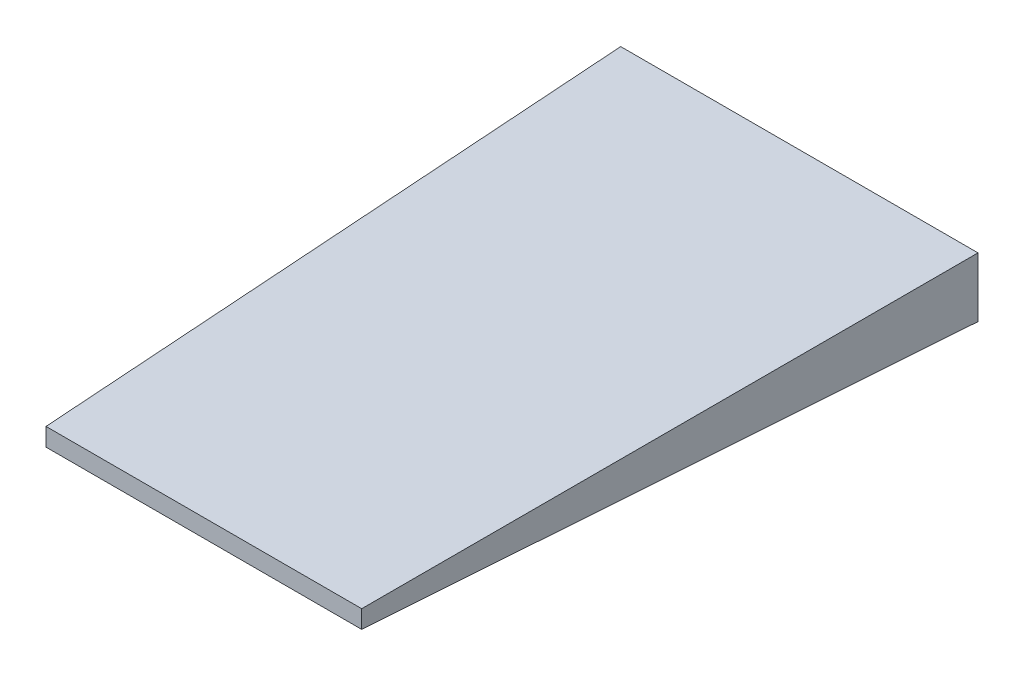
ISO-10303-21;
HEADER;
FILE_DESCRIPTION(('STEP AP214'),'2;1');
FILE_NAME('part.step','',(''),(''),'','','');
FILE_SCHEMA(('AUTOMOTIVE_DESIGN { 1 0 10303 214 1 1 1 1 }'));
ENDSEC;
DATA;
#1=APPLICATION_CONTEXT('core data for automotive mechanical design processes');
#2=APPLICATION_PROTOCOL_DEFINITION('international standard','automotive_design',2000,#1);
#3=PRODUCT_CONTEXT('',#1,'mechanical');
#4=PRODUCT('Part','Part','',(#3));
#5=PRODUCT_RELATED_PRODUCT_CATEGORY('part','',(#4));
#6=PRODUCT_DEFINITION_FORMATION('','',#4);
#7=PRODUCT_DEFINITION_CONTEXT('part definition',#1,'design');
#8=PRODUCT_DEFINITION('design','',#6,#7);
#9=PRODUCT_DEFINITION_SHAPE('','',#8);
#10=(LENGTH_UNIT() NAMED_UNIT(*) SI_UNIT(.MILLI.,.METRE.));
#11=(NAMED_UNIT(*) PLANE_ANGLE_UNIT() SI_UNIT($,.RADIAN.));
#12=(NAMED_UNIT(*) SI_UNIT($,.STERADIAN.) SOLID_ANGLE_UNIT());
#13=UNCERTAINTY_MEASURE_WITH_UNIT(LENGTH_MEASURE(1.E-05),#10,'distance_accuracy_value','');
#14=(GEOMETRIC_REPRESENTATION_CONTEXT(3) GLOBAL_UNCERTAINTY_ASSIGNED_CONTEXT((#13)) GLOBAL_UNIT_ASSIGNED_CONTEXT((#10,
#11,#12)) REPRESENTATION_CONTEXT('',''));
#15=CARTESIAN_POINT('',(0.,0.,0.));
#16=DIRECTION('',(0.,0.,1.));
#17=DIRECTION('',(1.,0.,0.));
#18=AXIS2_PLACEMENT_3D('',#15,#16,#17);
#19=CARTESIAN_POINT('',(-76.2,12.7,0.));
#20=DIRECTION('',(0.,0.999390827019096,0.034899496702501));
#21=DIRECTION('',(0.,-0.0348994967025011,0.999390827019096));
#22=AXIS2_PLACEMENT_3D('',#19,#20,#21);
#23=PLANE('',#22);
#24=DIRECTION('',(1.,0.,0.));
#25=VECTOR('',#24,1.);
#26=CARTESIAN_POINT('',(-76.2,12.7,0.));
#27=LINE('',#26,#25);
#28=CARTESIAN_POINT('',(-76.2,12.7,0.));
#29=VERTEX_POINT('',#28);
#30=CARTESIAN_POINT('',(76.2,12.7,0.));
#31=VERTEX_POINT('',#30);
#32=EDGE_CURVE('E83',#29,#31,#27,.T.);
#33=ORIENTED_EDGE('',*,*,#32,.F.);
#34=DIRECTION('',(-0.0348782627423747,0.0348782627423747,-0.998782765958718));
#35=VECTOR('',#34,1.);
#36=CARTESIAN_POINT('',(-76.1691010724171,12.6691010724171,0.884829516435063));
#37=LINE('',#36,#35);
#38=CARTESIAN_POINT('',(-67.3301245490961,3.83012454909606,254.));
#39=VERTEX_POINT('',#38);
#40=EDGE_CURVE('E11',#39,#29,#37,.T.);
#41=ORIENTED_EDGE('',*,*,#40,.F.);
#42=DIRECTION('',(1.,0.,0.));
#43=VECTOR('',#42,1.);
#44=CARTESIAN_POINT('',(-76.2,3.83012454909606,254.));
#45=LINE('',#44,#43);
#46=CARTESIAN_POINT('',(67.3301245490961,3.83012454909606,254.));
#47=VERTEX_POINT('',#46);
#48=EDGE_CURVE('E85',#39,#47,#45,.T.);
#49=ORIENTED_EDGE('',*,*,#48,.T.);
#50=DIRECTION('',(-0.0348782627423747,-0.0348782627423747,0.998782765958718));
#51=VECTOR('',#50,1.);
#52=CARTESIAN_POINT('',(76.1691010724171,12.6691010724171,0.884829516435063));
#53=LINE('',#52,#51);
#54=EDGE_CURVE('E80',#47,#31,#53,.F.);
#55=ORIENTED_EDGE('',*,*,#54,.T.);
#56=EDGE_LOOP('',(#33,#41,#49,#55));
#57=FACE_BOUND('',#56,.T.);
#58=ADVANCED_FACE('F33',(#57),#23,.T.);
#59=CARTESIAN_POINT('',(-76.2,-12.7,0.));
#60=DIRECTION('',(-0.999390827019096,0.,0.034899496702501));
#61=DIRECTION('',(0.034899496702501,0.,0.999390827019096));
#62=AXIS2_PLACEMENT_3D('',#59,#60,#61);
#63=PLANE('',#62);
#64=DIRECTION('',(0.,1.,0.));
#65=VECTOR('',#64,1.);
#66=CARTESIAN_POINT('',(-76.2,-12.7,0.));
#67=LINE('',#66,#65);
#68=CARTESIAN_POINT('',(-76.2,-12.7,0.));
#69=VERTEX_POINT('',#68);
#70=EDGE_CURVE('E98',#69,#29,#67,.T.);
#71=ORIENTED_EDGE('',*,*,#70,.F.);
#72=DIRECTION('',(0.0348782627423747,0.0348782627423747,0.998782765958718));
#73=VECTOR('',#72,1.);
#74=CARTESIAN_POINT('',(-76.2,-12.7,0.));
#75=LINE('',#74,#73);
#76=CARTESIAN_POINT('',(-67.3301245490961,-3.83012454909606,254.));
#77=VERTEX_POINT('',#76);
#78=EDGE_CURVE('E43',#77,#69,#75,.F.);
#79=ORIENTED_EDGE('',*,*,#78,.F.);
#80=DIRECTION('',(0.,1.,0.));
#81=VECTOR('',#80,1.);
#82=CARTESIAN_POINT('',(-67.3301245490961,-12.7,254.));
#83=LINE('',#82,#81);
#84=EDGE_CURVE('E88',#77,#39,#83,.T.);
#85=ORIENTED_EDGE('',*,*,#84,.T.);
#86=ORIENTED_EDGE('',*,*,#40,.T.);
#87=EDGE_LOOP('',(#71,#79,#85,#86));
#88=FACE_BOUND('',#87,.T.);
#89=ADVANCED_FACE('F35',(#88),#63,.T.);
#90=CARTESIAN_POINT('',(-76.2,-12.7,0.));
#91=DIRECTION('',(0.,-0.999390827019096,0.034899496702501));
#92=DIRECTION('',(0.,-0.0348994967025011,-0.999390827019096));
#93=AXIS2_PLACEMENT_3D('',#90,#91,#92);
#94=PLANE('',#93);
#95=DIRECTION('',(1.,0.,0.));
#96=VECTOR('',#95,1.);
#97=CARTESIAN_POINT('',(-76.2,-12.7,0.));
#98=LINE('',#97,#96);
#99=CARTESIAN_POINT('',(76.2,-12.7,0.));
#100=VERTEX_POINT('',#99);
#101=EDGE_CURVE('E95',#69,#100,#98,.T.);
#102=ORIENTED_EDGE('',*,*,#101,.T.);
#103=DIRECTION('',(0.0348782627423747,-0.0348782627423747,-0.998782765958718));
#104=VECTOR('',#103,1.);
#105=CARTESIAN_POINT('',(76.2,-12.7,0.));
#106=LINE('',#105,#104);
#107=CARTESIAN_POINT('',(67.3301245490961,-3.83012454909606,254.));
#108=VERTEX_POINT('',#107);
#109=EDGE_CURVE('E87',#108,#100,#106,.T.);
#110=ORIENTED_EDGE('',*,*,#109,.F.);
#111=DIRECTION('',(-1.,0.,0.));
#112=VECTOR('',#111,1.);
#113=CARTESIAN_POINT('',(-76.2,-3.83012454909606,254.));
#114=LINE('',#113,#112);
#115=EDGE_CURVE('E63',#77,#108,#114,.F.);
#116=ORIENTED_EDGE('',*,*,#115,.F.);
#117=ORIENTED_EDGE('',*,*,#78,.T.);
#118=EDGE_LOOP('',(#102,#110,#116,#117));
#119=FACE_BOUND('',#118,.T.);
#120=ADVANCED_FACE('F114',(#119),#94,.T.);
#121=CARTESIAN_POINT('',(76.2,-12.7,0.));
#122=DIRECTION('',(0.999390827019096,0.,0.034899496702501));
#123=DIRECTION('',(0.034899496702501,0.,-0.999390827019096));
#124=AXIS2_PLACEMENT_3D('',#121,#122,#123);
#125=PLANE('',#124);
#126=DIRECTION('',(0.,1.,0.));
#127=VECTOR('',#126,1.);
#128=CARTESIAN_POINT('',(76.2,-12.7,0.));
#129=LINE('',#128,#127);
#130=EDGE_CURVE('E92',#100,#31,#129,.T.);
#131=ORIENTED_EDGE('',*,*,#130,.T.);
#132=ORIENTED_EDGE('',*,*,#54,.F.);
#133=DIRECTION('',(0.,-1.,0.));
#134=VECTOR('',#133,1.);
#135=CARTESIAN_POINT('',(67.3301245490961,-12.7,254.));
#136=LINE('',#135,#134);
#137=EDGE_CURVE('E37',#108,#47,#136,.F.);
#138=ORIENTED_EDGE('',*,*,#137,.F.);
#139=ORIENTED_EDGE('',*,*,#109,.T.);
#140=EDGE_LOOP('',(#131,#132,#138,#139));
#141=FACE_BOUND('',#140,.T.);
#142=ADVANCED_FACE('F93',(#141),#125,.T.);
#143=CARTESIAN_POINT('',(0.,0.,254.));
#144=DIRECTION('',(0.,0.,1.));
#145=DIRECTION('',(1.,0.,0.));
#146=AXIS2_PLACEMENT_3D('',#143,#144,#145);
#147=PLANE('',#146);
#148=ORIENTED_EDGE('',*,*,#48,.F.);
#149=ORIENTED_EDGE('',*,*,#84,.F.);
#150=ORIENTED_EDGE('',*,*,#115,.T.);
#151=ORIENTED_EDGE('',*,*,#137,.T.);
#152=EDGE_LOOP('',(#148,#149,#150,#151));
#153=FACE_BOUND('',#152,.T.);
#154=ADVANCED_FACE('F106',(#153),#147,.T.);
#155=CARTESIAN_POINT('',(0.,0.,0.));
#156=DIRECTION('',(0.,0.,1.));
#157=DIRECTION('',(1.,0.,0.));
#158=AXIS2_PLACEMENT_3D('',#155,#156,#157);
#159=PLANE('',#158);
#160=ORIENTED_EDGE('',*,*,#32,.T.);
#161=ORIENTED_EDGE('',*,*,#130,.F.);
#162=ORIENTED_EDGE('',*,*,#101,.F.);
#163=ORIENTED_EDGE('',*,*,#70,.T.);
#164=EDGE_LOOP('',(#160,#161,#162,#163));
#165=FACE_BOUND('',#164,.T.);
#166=ADVANCED_FACE('F97',(#165),#159,.F.);
#167=CLOSED_SHELL('',(#58,#89,#120,#142,#154,#166));
#168=MANIFOLD_SOLID_BREP('B2',#167);
#169=ADVANCED_BREP_SHAPE_REPRESENTATION('',(#18,#168),#14);
#170=SHAPE_DEFINITION_REPRESENTATION(#9,#169);
ENDSEC;
END-ISO-10303-21;
